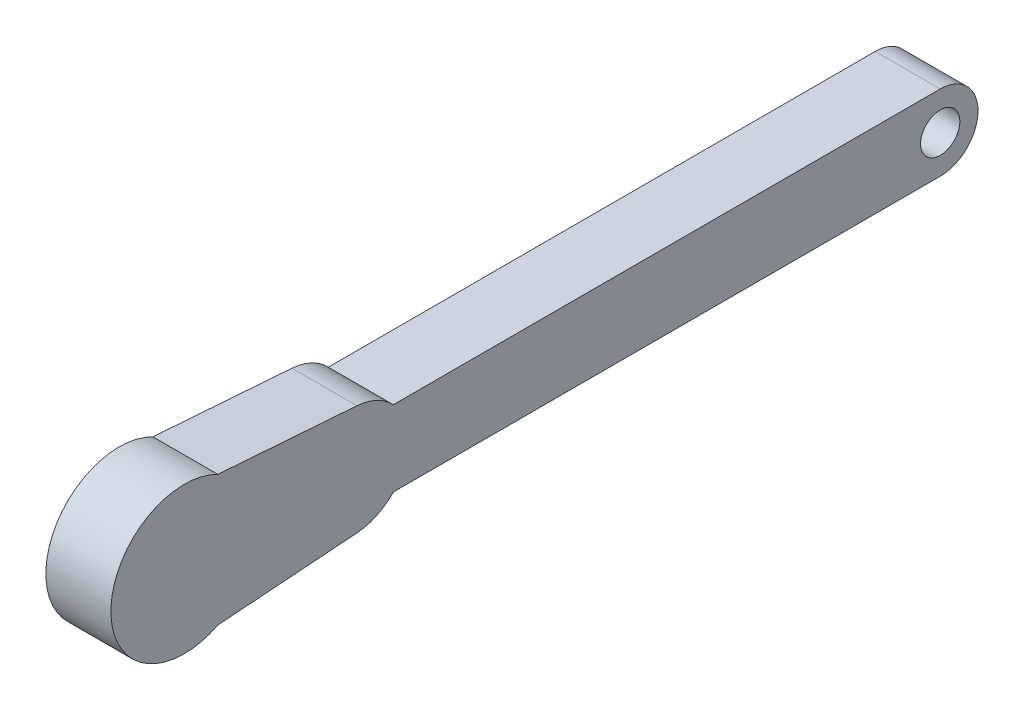
ISO-10303-21;
HEADER;
FILE_DESCRIPTION(('STEP AP214'),'2;1');
FILE_NAME('part.step','',(''),(''),'','','');
FILE_SCHEMA(('AUTOMOTIVE_DESIGN { 1 0 10303 214 1 1 1 1 }'));
ENDSEC;
DATA;
#1=APPLICATION_CONTEXT('core data for automotive mechanical design processes');
#2=APPLICATION_PROTOCOL_DEFINITION('international standard','automotive_design',2000,#1);
#3=PRODUCT_CONTEXT('',#1,'mechanical');
#4=PRODUCT('Part','Part','',(#3));
#5=PRODUCT_RELATED_PRODUCT_CATEGORY('part','',(#4));
#6=PRODUCT_DEFINITION_FORMATION('','',#4);
#7=PRODUCT_DEFINITION_CONTEXT('part definition',#1,'design');
#8=PRODUCT_DEFINITION('design','',#6,#7);
#9=PRODUCT_DEFINITION_SHAPE('','',#8);
#10=(LENGTH_UNIT() NAMED_UNIT(*) SI_UNIT(.MILLI.,.METRE.));
#11=(NAMED_UNIT(*) PLANE_ANGLE_UNIT() SI_UNIT($,.RADIAN.));
#12=(NAMED_UNIT(*) SI_UNIT($,.STERADIAN.) SOLID_ANGLE_UNIT());
#13=UNCERTAINTY_MEASURE_WITH_UNIT(LENGTH_MEASURE(1.E-05),#10,'distance_accuracy_value','');
#14=(GEOMETRIC_REPRESENTATION_CONTEXT(3) GLOBAL_UNCERTAINTY_ASSIGNED_CONTEXT((#13)) GLOBAL_UNIT_ASSIGNED_CONTEXT((#10,
#11,#12)) REPRESENTATION_CONTEXT('',''));
#15=CARTESIAN_POINT('',(0.,0.,0.));
#16=DIRECTION('',(0.,0.,1.));
#17=DIRECTION('',(1.,0.,0.));
#18=AXIS2_PLACEMENT_3D('',#15,#16,#17);
#19=CARTESIAN_POINT('',(-2.73049999999999,3.175,23.1775));
#20=DIRECTION('',(1.,0.,0.));
#21=DIRECTION('',(0.,0.,-1.));
#22=AXIS2_PLACEMENT_3D('',#19,#20,#21);
#23=PLANE('',#22);
#24=CARTESIAN_POINT('',(-2.73049999999999,0.,-45.4025));
#25=DIRECTION('',(-1.,0.,0.));
#26=DIRECTION('',(0.,0.,1.));
#27=AXIS2_PLACEMENT_3D('',#24,#25,#26);
#28=CIRCLE('',#27,1.65);
#29=CARTESIAN_POINT('',(-2.73049999999999,0.,-43.7525));
#30=VERTEX_POINT('',#29);
#31=EDGE_CURVE('E281',#30,#30,#28,.T.);
#32=ORIENTED_EDGE('',*,*,#31,.F.);
#33=EDGE_LOOP('',(#32));
#34=FACE_BOUND('',#33,.T.);
#35=DIRECTION('',(0.,-0.0727458135103877,-0.997350513418784));
#36=VECTOR('',#35,1.);
#37=CARTESIAN_POINT('',(-2.73049999999999,3.11418880814252,16.004814627746));
#38=LINE('',#37,#36);
#39=CARTESIAN_POINT('',(-2.73049999999999,3.11418880814252,16.004814627746));
#40=VERTEX_POINT('',#39);
#41=CARTESIAN_POINT('',(-2.73049999999999,2.22109959338366,3.76049507331097));
#42=VERTEX_POINT('',#41);
#43=EDGE_CURVE('E186',#40,#42,#38,.T.);
#44=ORIENTED_EDGE('',*,*,#43,.F.);
#45=CARTESIAN_POINT('',(-2.73049999999999,0.,18.0974999999986));
#46=DIRECTION('',(-1.,0.,0.));
#47=DIRECTION('',(0.,0.,1.));
#48=AXIS2_PLACEMENT_3D('',#45,#46,#47);
#49=CIRCLE('',#48,3.752);
#50=CARTESIAN_POINT('',(-2.73049999999999,-3.11418880814246,16.004814627746));
#51=VERTEX_POINT('',#50);
#52=EDGE_CURVE('E150',#51,#40,#49,.T.);
#53=ORIENTED_EDGE('',*,*,#52,.F.);
#54=DIRECTION('',(0.,-0.0727458135103876,0.997350513418784));
#55=VECTOR('',#54,1.);
#56=CARTESIAN_POINT('',(-2.73049999999999,-2.22109959338361,3.76049507331097));
#57=LINE('',#56,#55);
#58=CARTESIAN_POINT('',(-2.73049999999999,-2.22109959338361,3.76049507331097));
#59=VERTEX_POINT('',#58);
#60=EDGE_CURVE('E170',#59,#51,#57,.T.);
#61=ORIENTED_EDGE('',*,*,#60,.F.);
#62=CARTESIAN_POINT('',(-2.73049999999999,0.,3.9224999999986));
#63=DIRECTION('',(-1.,0.,0.));
#64=DIRECTION('',(0.,0.,1.));
#65=AXIS2_PLACEMENT_3D('',#62,#63,#64);
#66=CIRCLE('',#65,2.227);
#67=EDGE_CURVE('E174',#42,#59,#66,.T.);
#68=ORIENTED_EDGE('',*,*,#67,.F.);
#69=EDGE_LOOP('',(#44,#53,#61,#68));
#70=FACE_BOUND('',#69,.T.);
#71=CARTESIAN_POINT('',(-2.7305,0.,-45.4025));
#72=DIRECTION('',(1.,0.,0.));
#73=DIRECTION('',(0.,0.,-1.));
#74=AXIS2_PLACEMENT_3D('',#71,#72,#73);
#75=CIRCLE('',#74,3.175);
#76=CARTESIAN_POINT('',(-2.7305,3.175,-45.4025));
#77=VERTEX_POINT('',#76);
#78=CARTESIAN_POINT('',(-2.7305,0.,-48.5775));
#79=VERTEX_POINT('',#78);
#80=EDGE_CURVE('E263',#77,#79,#75,.F.);
#81=ORIENTED_EDGE('',*,*,#80,.T.);
#82=CARTESIAN_POINT('',(-2.7305,0.,-45.4025));
#83=DIRECTION('',(1.,0.,0.));
#84=DIRECTION('',(0.,0.,-1.));
#85=AXIS2_PLACEMENT_3D('',#82,#83,#84);
#86=CIRCLE('',#85,3.175);
#87=CARTESIAN_POINT('',(-2.7305,-3.175,-45.4025));
#88=VERTEX_POINT('',#87);
#89=EDGE_CURVE('E266',#79,#88,#86,.F.);
#90=ORIENTED_EDGE('',*,*,#89,.T.);
#91=DIRECTION('',(0.,0.,1.));
#92=VECTOR('',#91,1.);
#93=CARTESIAN_POINT('',(-2.73049999999999,-3.175,23.1775));
#94=LINE('',#93,#92);
#95=CARTESIAN_POINT('',(-2.73049999999999,-3.175,0.538866597870074));
#96=VERTEX_POINT('',#95);
#97=EDGE_CURVE('E247',#88,#96,#94,.T.);
#98=ORIENTED_EDGE('',*,*,#97,.T.);
#99=CARTESIAN_POINT('',(-2.73049999999999,0.,3.9224999999986));
#100=DIRECTION('',(-1.,0.,0.));
#101=DIRECTION('',(0.,0.,1.));
#102=AXIS2_PLACEMENT_3D('',#99,#100,#101);
#103=CIRCLE('',#102,4.64);
#104=CARTESIAN_POINT('',(-2.73049999999999,-4.62770638226314,3.5849594253104));
#105=VERTEX_POINT('',#104);
#106=EDGE_CURVE('E219',#96,#105,#103,.T.);
#107=ORIENTED_EDGE('',*,*,#106,.T.);
#108=DIRECTION('',(0.,-0.0727458135103876,0.997350513418784));
#109=VECTOR('',#108,1.);
#110=CARTESIAN_POINT('',(-2.73049999999999,-5.48027225622546,15.2737009636567));
#111=LINE('',#110,#109);
#112=CARTESIAN_POINT('',(-2.73049999999999,-5.48027225622546,15.2737009636567));
#113=VERTEX_POINT('',#112);
#114=EDGE_CURVE('E224',#105,#113,#111,.T.);
#115=ORIENTED_EDGE('',*,*,#114,.T.);
#116=CARTESIAN_POINT('',(-2.73049999999999,0.,18.0974999999986));
#117=DIRECTION('',(-1.,0.,0.));
#118=DIRECTION('',(0.,0.,1.));
#119=AXIS2_PLACEMENT_3D('',#116,#117,#118);
#120=CIRCLE('',#119,6.16500000000001);
#121=CARTESIAN_POINT('',(-2.73049999999999,5.48027225622551,15.2737009636567));
#122=VERTEX_POINT('',#121);
#123=EDGE_CURVE('E195',#113,#122,#120,.T.);
#124=ORIENTED_EDGE('',*,*,#123,.T.);
#125=DIRECTION('',(0.,-0.0727458135103877,-0.997350513418784));
#126=VECTOR('',#125,1.);
#127=CARTESIAN_POINT('',(-2.73049999999999,4.62770638226318,3.58495942531041));
#128=LINE('',#127,#126);
#129=CARTESIAN_POINT('',(-2.73049999999999,4.62770638226318,3.58495942531041));
#130=VERTEX_POINT('',#129);
#131=EDGE_CURVE('E215',#122,#130,#128,.T.);
#132=ORIENTED_EDGE('',*,*,#131,.T.);
#133=CARTESIAN_POINT('',(-2.73049999999999,3.175,0.538866597870028));
#134=VERTEX_POINT('',#133);
#135=EDGE_CURVE('E220',#130,#134,#103,.T.);
#136=ORIENTED_EDGE('',*,*,#135,.T.);
#137=DIRECTION('',(0.,0.,1.));
#138=VECTOR('',#137,1.);
#139=CARTESIAN_POINT('',(-2.73049999999999,3.175,23.1775));
#140=LINE('',#139,#138);
#141=EDGE_CURVE('E248',#77,#134,#140,.T.);
#142=ORIENTED_EDGE('',*,*,#141,.F.);
#143=EDGE_LOOP('',(#81,#90,#98,#107,#115,#124,#132,#136,#142));
#144=FACE_BOUND('',#143,.T.);
#145=ADVANCED_FACE('F47',(#34,#70,#144),#23,.F.);
#146=CARTESIAN_POINT('',(2.73049999999999,3.175,23.1775));
#147=DIRECTION('',(-1.,0.,0.));
#148=DIRECTION('',(0.,0.,1.));
#149=AXIS2_PLACEMENT_3D('',#146,#147,#148);
#150=PLANE('',#149);
#151=CARTESIAN_POINT('',(2.7305,0.,-45.4025));
#152=DIRECTION('',(-1.,0.,0.));
#153=DIRECTION('',(0.,0.,1.));
#154=AXIS2_PLACEMENT_3D('',#151,#152,#153);
#155=CIRCLE('',#154,1.65);
#156=CARTESIAN_POINT('',(2.7305,0.,-43.7525));
#157=VERTEX_POINT('',#156);
#158=EDGE_CURVE('E177',#157,#157,#155,.T.);
#159=ORIENTED_EDGE('',*,*,#158,.T.);
#160=EDGE_LOOP('',(#159));
#161=FACE_BOUND('',#160,.T.);
#162=DIRECTION('',(0.,0.,-1.));
#163=VECTOR('',#162,1.);
#164=CARTESIAN_POINT('',(2.73049999999999,-3.175,23.1775));
#165=LINE('',#164,#163);
#166=CARTESIAN_POINT('',(2.73049999999999,-3.175,0.538866597870072));
#167=VERTEX_POINT('',#166);
#168=CARTESIAN_POINT('',(2.7305,-3.175,-45.4025));
#169=VERTEX_POINT('',#168);
#170=EDGE_CURVE('E252',#167,#169,#165,.T.);
#171=ORIENTED_EDGE('',*,*,#170,.T.);
#172=CARTESIAN_POINT('',(2.7305,0.,-45.4025));
#173=DIRECTION('',(-1.,0.,0.));
#174=DIRECTION('',(0.,0.,1.));
#175=AXIS2_PLACEMENT_3D('',#172,#173,#174);
#176=CIRCLE('',#175,3.175);
#177=CARTESIAN_POINT('',(2.7305,0.,-48.5775));
#178=VERTEX_POINT('',#177);
#179=EDGE_CURVE('E64',#169,#178,#176,.F.);
#180=ORIENTED_EDGE('',*,*,#179,.T.);
#181=CARTESIAN_POINT('',(2.7305,0.,-45.4025));
#182=DIRECTION('',(-1.,0.,0.));
#183=DIRECTION('',(0.,0.,1.));
#184=AXIS2_PLACEMENT_3D('',#181,#182,#183);
#185=CIRCLE('',#184,3.175);
#186=CARTESIAN_POINT('',(2.7305,3.175,-45.4025));
#187=VERTEX_POINT('',#186);
#188=EDGE_CURVE('E68',#178,#187,#185,.F.);
#189=ORIENTED_EDGE('',*,*,#188,.T.);
#190=DIRECTION('',(0.,0.,-1.));
#191=VECTOR('',#190,1.);
#192=CARTESIAN_POINT('',(2.73049999999999,3.175,23.1775));
#193=LINE('',#192,#191);
#194=CARTESIAN_POINT('',(2.73049999999999,3.175,0.538866597870028));
#195=VERTEX_POINT('',#194);
#196=EDGE_CURVE('E251',#195,#187,#193,.T.);
#197=ORIENTED_EDGE('',*,*,#196,.F.);
#198=CARTESIAN_POINT('',(2.73049999999999,0.,3.9224999999986));
#199=DIRECTION('',(-1.,0.,0.));
#200=DIRECTION('',(0.,0.,1.));
#201=AXIS2_PLACEMENT_3D('',#198,#199,#200);
#202=CIRCLE('',#201,4.64);
#203=CARTESIAN_POINT('',(2.73049999999999,4.62770638226318,3.58495942531041));
#204=VERTEX_POINT('',#203);
#205=EDGE_CURVE('E205',#195,#204,#202,.F.);
#206=ORIENTED_EDGE('',*,*,#205,.T.);
#207=DIRECTION('',(0.,0.0727458135103877,0.997350513418784));
#208=VECTOR('',#207,1.);
#209=CARTESIAN_POINT('',(2.73049999999999,4.62770638226318,3.5849594253104));
#210=LINE('',#209,#208);
#211=CARTESIAN_POINT('',(2.73049999999999,5.48027225622551,15.2737009636567));
#212=VERTEX_POINT('',#211);
#213=EDGE_CURVE('E211',#204,#212,#210,.T.);
#214=ORIENTED_EDGE('',*,*,#213,.T.);
#215=CARTESIAN_POINT('',(2.73049999999999,0.,18.0974999999986));
#216=DIRECTION('',(-1.,0.,0.));
#217=DIRECTION('',(0.,0.,1.));
#218=AXIS2_PLACEMENT_3D('',#215,#216,#217);
#219=CIRCLE('',#218,6.16500000000001);
#220=CARTESIAN_POINT('',(2.73049999999999,-5.48027225622546,15.2737009636567));
#221=VERTEX_POINT('',#220);
#222=EDGE_CURVE('E208',#212,#221,#219,.F.);
#223=ORIENTED_EDGE('',*,*,#222,.T.);
#224=DIRECTION('',(0.,0.0727458135103876,-0.997350513418784));
#225=VECTOR('',#224,1.);
#226=CARTESIAN_POINT('',(2.73049999999999,-5.48027225622546,15.2737009636567));
#227=LINE('',#226,#225);
#228=CARTESIAN_POINT('',(2.73049999999999,-4.62770638226314,3.5849594253104));
#229=VERTEX_POINT('',#228);
#230=EDGE_CURVE('E204',#221,#229,#227,.T.);
#231=ORIENTED_EDGE('',*,*,#230,.T.);
#232=EDGE_CURVE('E201',#229,#167,#202,.F.);
#233=ORIENTED_EDGE('',*,*,#232,.T.);
#234=EDGE_LOOP('',(#171,#180,#189,#197,#206,#214,#223,#231,#233));
#235=FACE_BOUND('',#234,.T.);
#236=ADVANCED_FACE('F305',(#161,#235),#150,.F.);
#237=CARTESIAN_POINT('',(0.,3.175,0.));
#238=DIRECTION('',(0.,1.,0.));
#239=DIRECTION('',(0.,0.,1.));
#240=AXIS2_PLACEMENT_3D('',#237,#238,#239);
#241=PLANE('',#240);
#242=ORIENTED_EDGE('',*,*,#196,.T.);
#243=DIRECTION('',(-1.,0.,0.));
#244=VECTOR('',#243,1.);
#245=CARTESIAN_POINT('',(-2.7305,3.175,-45.4025));
#246=LINE('',#245,#244);
#247=EDGE_CURVE('E57',#187,#77,#246,.T.);
#248=ORIENTED_EDGE('',*,*,#247,.T.);
#249=ORIENTED_EDGE('',*,*,#141,.T.);
#250=DIRECTION('',(-1.,0.,0.));
#251=VECTOR('',#250,1.);
#252=CARTESIAN_POINT('',(30.5878024537553,3.175,0.538866597870028));
#253=LINE('',#252,#251);
#254=EDGE_CURVE('E243',#195,#134,#253,.T.);
#255=ORIENTED_EDGE('',*,*,#254,.F.);
#256=EDGE_LOOP('',(#242,#248,#249,#255));
#257=FACE_BOUND('',#256,.T.);
#258=ADVANCED_FACE('F312',(#257),#241,.T.);
#259=CARTESIAN_POINT('',(0.,-3.175,0.));
#260=DIRECTION('',(0.,1.,0.));
#261=DIRECTION('',(0.,0.,1.));
#262=AXIS2_PLACEMENT_3D('',#259,#260,#261);
#263=PLANE('',#262);
#264=ORIENTED_EDGE('',*,*,#97,.F.);
#265=DIRECTION('',(-1.,0.,0.));
#266=VECTOR('',#265,1.);
#267=CARTESIAN_POINT('',(0.,-3.175,-45.4025));
#268=LINE('',#267,#266);
#269=EDGE_CURVE('E269',#88,#169,#268,.F.);
#270=ORIENTED_EDGE('',*,*,#269,.T.);
#271=ORIENTED_EDGE('',*,*,#170,.F.);
#272=DIRECTION('',(-1.,0.,0.));
#273=VECTOR('',#272,1.);
#274=CARTESIAN_POINT('',(30.5878024537553,-3.175,0.538866597870074));
#275=LINE('',#274,#273);
#276=EDGE_CURVE('E255',#167,#96,#275,.T.);
#277=ORIENTED_EDGE('',*,*,#276,.T.);
#278=EDGE_LOOP('',(#264,#270,#271,#277));
#279=FACE_BOUND('',#278,.T.);
#280=ADVANCED_FACE('F376',(#279),#263,.F.);
#281=CARTESIAN_POINT('',(30.5878024537553,0.,3.9224999999986));
#282=DIRECTION('',(-1.,0.,0.));
#283=DIRECTION('',(0.,0.,1.));
#284=AXIS2_PLACEMENT_3D('',#281,#282,#283);
#285=CYLINDRICAL_SURFACE('',#284,4.64);
#286=ORIENTED_EDGE('',*,*,#276,.F.);
#287=ORIENTED_EDGE('',*,*,#232,.F.);
#288=DIRECTION('',(-1.,0.,0.));
#289=VECTOR('',#288,1.);
#290=CARTESIAN_POINT('',(30.5878024537553,-4.62770638226314,3.5849594253104));
#291=LINE('',#290,#289);
#292=EDGE_CURVE('E232',#229,#105,#291,.T.);
#293=ORIENTED_EDGE('',*,*,#292,.T.);
#294=ORIENTED_EDGE('',*,*,#106,.F.);
#295=EDGE_LOOP('',(#286,#287,#293,#294));
#296=FACE_BOUND('',#295,.T.);
#297=ADVANCED_FACE('F351',(#296),#285,.T.);
#298=CARTESIAN_POINT('',(30.5878024537553,0.,18.0974999999986));
#299=DIRECTION('',(-1.,0.,0.));
#300=DIRECTION('',(0.,0.,1.));
#301=AXIS2_PLACEMENT_3D('',#298,#299,#300);
#302=CYLINDRICAL_SURFACE('',#301,6.16500000000001);
#303=ORIENTED_EDGE('',*,*,#222,.F.);
#304=DIRECTION('',(-1.,0.,0.));
#305=VECTOR('',#304,1.);
#306=CARTESIAN_POINT('',(30.5878024537553,5.48027225622551,15.2737009636567));
#307=LINE('',#306,#305);
#308=EDGE_CURVE('E228',#212,#122,#307,.T.);
#309=ORIENTED_EDGE('',*,*,#308,.T.);
#310=ORIENTED_EDGE('',*,*,#123,.F.);
#311=DIRECTION('',(-1.,0.,0.));
#312=VECTOR('',#311,1.);
#313=CARTESIAN_POINT('',(30.5878024537553,-5.48027225622546,15.2737009636567));
#314=LINE('',#313,#312);
#315=EDGE_CURVE('E229',#221,#113,#314,.T.);
#316=ORIENTED_EDGE('',*,*,#315,.F.);
#317=EDGE_LOOP('',(#303,#309,#310,#316));
#318=FACE_BOUND('',#317,.T.);
#319=ADVANCED_FACE('F358',(#318),#302,.T.);
#320=CARTESIAN_POINT('',(30.5878024537553,-5.48027225622546,15.2737009636567));
#321=DIRECTION('',(0.,-0.997350513418784,-0.0727458135103876));
#322=DIRECTION('',(0.,0.0727458135103876,-0.997350513418784));
#323=AXIS2_PLACEMENT_3D('',#320,#321,#322);
#324=PLANE('',#323);
#325=ORIENTED_EDGE('',*,*,#230,.F.);
#326=ORIENTED_EDGE('',*,*,#315,.T.);
#327=ORIENTED_EDGE('',*,*,#114,.F.);
#328=ORIENTED_EDGE('',*,*,#292,.F.);
#329=EDGE_LOOP('',(#325,#326,#327,#328));
#330=FACE_BOUND('',#329,.T.);
#331=ADVANCED_FACE('F354',(#330),#324,.T.);
#332=ORIENTED_EDGE('',*,*,#205,.F.);
#333=ORIENTED_EDGE('',*,*,#254,.T.);
#334=ORIENTED_EDGE('',*,*,#135,.F.);
#335=DIRECTION('',(-1.,0.,0.));
#336=VECTOR('',#335,1.);
#337=CARTESIAN_POINT('',(30.5878024537553,4.62770638226318,3.58495942531041));
#338=LINE('',#337,#336);
#339=EDGE_CURVE('E236',#204,#130,#338,.T.);
#340=ORIENTED_EDGE('',*,*,#339,.F.);
#341=EDGE_LOOP('',(#332,#333,#334,#340));
#342=FACE_BOUND('',#341,.T.);
#343=ADVANCED_FACE('F339',(#342),#285,.T.);
#344=CARTESIAN_POINT('',(30.5878024537553,4.62770638226318,3.58495942531041));
#345=DIRECTION('',(0.,0.997350513418784,-0.0727458135103877));
#346=DIRECTION('',(0.,0.0727458135103877,0.997350513418784));
#347=AXIS2_PLACEMENT_3D('',#344,#345,#346);
#348=PLANE('',#347);
#349=ORIENTED_EDGE('',*,*,#213,.F.);
#350=ORIENTED_EDGE('',*,*,#339,.T.);
#351=ORIENTED_EDGE('',*,*,#131,.F.);
#352=ORIENTED_EDGE('',*,*,#308,.F.);
#353=EDGE_LOOP('',(#349,#350,#351,#352));
#354=FACE_BOUND('',#353,.T.);
#355=ADVANCED_FACE('F361',(#354),#348,.T.);
#356=CARTESIAN_POINT('',(-0.698499999999994,0.,18.0974999999986));
#357=DIRECTION('',(-1.,0.,0.));
#358=DIRECTION('',(0.,0.,1.));
#359=AXIS2_PLACEMENT_3D('',#356,#357,#358);
#360=CYLINDRICAL_SURFACE('',#359,3.752);
#361=ORIENTED_EDGE('',*,*,#52,.T.);
#362=DIRECTION('',(-1.,0.,0.));
#363=VECTOR('',#362,1.);
#364=CARTESIAN_POINT('',(-0.698499999999994,3.11418880814252,16.004814627746));
#365=LINE('',#364,#363);
#366=CARTESIAN_POINT('',(-0.698499999999994,3.11418880814252,16.004814627746));
#367=VERTEX_POINT('',#366);
#368=EDGE_CURVE('E143',#367,#40,#365,.T.);
#369=ORIENTED_EDGE('',*,*,#368,.F.);
#370=CARTESIAN_POINT('',(-0.698499999999994,0.,18.0974999999986));
#371=DIRECTION('',(-1.,0.,0.));
#372=DIRECTION('',(0.,0.,1.));
#373=AXIS2_PLACEMENT_3D('',#370,#371,#372);
#374=CIRCLE('',#373,3.752);
#375=CARTESIAN_POINT('',(-0.698499999999994,-3.11418880814246,16.004814627746));
#376=VERTEX_POINT('',#375);
#377=EDGE_CURVE('E147',#376,#367,#374,.T.);
#378=ORIENTED_EDGE('',*,*,#377,.F.);
#379=DIRECTION('',(-1.,0.,0.));
#380=VECTOR('',#379,1.);
#381=CARTESIAN_POINT('',(-0.698499999999994,-3.11418880814246,16.004814627746));
#382=LINE('',#381,#380);
#383=EDGE_CURVE('E192',#376,#51,#382,.T.);
#384=ORIENTED_EDGE('',*,*,#383,.T.);
#385=EDGE_LOOP('',(#361,#369,#378,#384));
#386=FACE_BOUND('',#385,.T.);
#387=ADVANCED_FACE('F145',(#386),#360,.F.);
#388=CARTESIAN_POINT('',(-0.698499999999994,-2.22109959338361,3.76049507331097));
#389=DIRECTION('',(0.,-0.997350513418784,-0.0727458135103875));
#390=DIRECTION('',(0.,0.0727458135103876,-0.997350513418784));
#391=AXIS2_PLACEMENT_3D('',#388,#389,#390);
#392=PLANE('',#391);
#393=ORIENTED_EDGE('',*,*,#60,.T.);
#394=ORIENTED_EDGE('',*,*,#383,.F.);
#395=DIRECTION('',(0.,-0.0727458135103876,0.997350513418784));
#396=VECTOR('',#395,1.);
#397=CARTESIAN_POINT('',(-0.698499999999994,-2.22109959338361,3.76049507331097));
#398=LINE('',#397,#396);
#399=CARTESIAN_POINT('',(-0.698499999999994,-2.22109959338361,3.76049507331097));
#400=VERTEX_POINT('',#399);
#401=EDGE_CURVE('E156',#400,#376,#398,.T.);
#402=ORIENTED_EDGE('',*,*,#401,.F.);
#403=DIRECTION('',(-1.,0.,0.));
#404=VECTOR('',#403,1.);
#405=CARTESIAN_POINT('',(-0.698499999999994,-2.22109959338361,3.76049507331097));
#406=LINE('',#405,#404);
#407=EDGE_CURVE('E196',#400,#59,#406,.T.);
#408=ORIENTED_EDGE('',*,*,#407,.T.);
#409=EDGE_LOOP('',(#393,#394,#402,#408));
#410=FACE_BOUND('',#409,.T.);
#411=ADVANCED_FACE('F368',(#410),#392,.F.);
#412=CARTESIAN_POINT('',(-0.698499999999994,0.,3.9224999999986));
#413=DIRECTION('',(-1.,0.,0.));
#414=DIRECTION('',(0.,0.,1.));
#415=AXIS2_PLACEMENT_3D('',#412,#413,#414);
#416=CYLINDRICAL_SURFACE('',#415,2.227);
#417=ORIENTED_EDGE('',*,*,#67,.T.);
#418=ORIENTED_EDGE('',*,*,#407,.F.);
#419=CARTESIAN_POINT('',(-0.698499999999994,0.,3.9224999999986));
#420=DIRECTION('',(-1.,0.,0.));
#421=DIRECTION('',(0.,0.,1.));
#422=AXIS2_PLACEMENT_3D('',#419,#420,#421);
#423=CIRCLE('',#422,2.227);
#424=CARTESIAN_POINT('',(-0.698499999999994,2.22109959338366,3.76049507331097));
#425=VERTEX_POINT('',#424);
#426=EDGE_CURVE('E165',#425,#400,#423,.T.);
#427=ORIENTED_EDGE('',*,*,#426,.F.);
#428=DIRECTION('',(-1.,0.,0.));
#429=VECTOR('',#428,1.);
#430=CARTESIAN_POINT('',(-0.698499999999994,2.22109959338366,3.76049507331097));
#431=LINE('',#430,#429);
#432=EDGE_CURVE('E155',#425,#42,#431,.T.);
#433=ORIENTED_EDGE('',*,*,#432,.T.);
#434=EDGE_LOOP('',(#417,#418,#427,#433));
#435=FACE_BOUND('',#434,.T.);
#436=ADVANCED_FACE('F422',(#435),#416,.F.);
#437=CARTESIAN_POINT('',(-0.698499999999994,3.11418880814252,16.004814627746));
#438=DIRECTION('',(0.,0.997350513418784,-0.0727458135103877));
#439=DIRECTION('',(0.,0.0727458135103877,0.997350513418784));
#440=AXIS2_PLACEMENT_3D('',#437,#438,#439);
#441=PLANE('',#440);
#442=ORIENTED_EDGE('',*,*,#43,.T.);
#443=ORIENTED_EDGE('',*,*,#432,.F.);
#444=DIRECTION('',(0.,-0.0727458135103877,-0.997350513418784));
#445=VECTOR('',#444,1.);
#446=CARTESIAN_POINT('',(-0.698499999999994,3.11418880814252,16.004814627746));
#447=LINE('',#446,#445);
#448=EDGE_CURVE('E159',#367,#425,#447,.T.);
#449=ORIENTED_EDGE('',*,*,#448,.F.);
#450=ORIENTED_EDGE('',*,*,#368,.T.);
#451=EDGE_LOOP('',(#442,#443,#449,#450));
#452=FACE_BOUND('',#451,.T.);
#453=ADVANCED_FACE('F160',(#452),#441,.F.);
#454=CARTESIAN_POINT('',(-0.698499999999994,0.,18.0974999999986));
#455=DIRECTION('',(-1.,0.,0.));
#456=DIRECTION('',(0.,0.,1.));
#457=AXIS2_PLACEMENT_3D('',#454,#455,#456);
#458=PLANE('',#457);
#459=CARTESIAN_POINT('',(-0.698499999999994,0.,18.0975));
#460=DIRECTION('',(-1.,0.,0.));
#461=DIRECTION('',(0.,0.,1.));
#462=AXIS2_PLACEMENT_3D('',#459,#460,#461);
#463=CIRCLE('',#462,2.500000016);
#464=CARTESIAN_POINT('',(-0.698499999999994,0.,20.597500016));
#465=VERTEX_POINT('',#464);
#466=EDGE_CURVE('E11',#465,#465,#463,.F.);
#467=ORIENTED_EDGE('',*,*,#466,.T.);
#468=EDGE_LOOP('',(#467));
#469=FACE_BOUND('',#468,.T.);
#470=ORIENTED_EDGE('',*,*,#377,.T.);
#471=ORIENTED_EDGE('',*,*,#448,.T.);
#472=ORIENTED_EDGE('',*,*,#426,.T.);
#473=ORIENTED_EDGE('',*,*,#401,.T.);
#474=EDGE_LOOP('',(#470,#471,#472,#473));
#475=FACE_BOUND('',#474,.T.);
#476=ADVANCED_FACE('F167',(#469,#475),#458,.T.);
#477=CARTESIAN_POINT('',(-2.73049999999999,0.,-45.4025));
#478=DIRECTION('',(-1.,0.,0.));
#479=DIRECTION('',(0.,0.,1.));
#480=AXIS2_PLACEMENT_3D('',#477,#478,#479);
#481=CYLINDRICAL_SURFACE('',#480,1.65);
#482=ORIENTED_EDGE('',*,*,#158,.F.);
#483=EDGE_LOOP('',(#482));
#484=FACE_BOUND('',#483,.T.);
#485=ORIENTED_EDGE('',*,*,#31,.T.);
#486=EDGE_LOOP('',(#485));
#487=FACE_BOUND('',#486,.T.);
#488=ADVANCED_FACE('F322',(#484,#487),#481,.F.);
#489=CARTESIAN_POINT('',(0.,0.,-45.4025));
#490=DIRECTION('',(1.,0.,0.));
#491=DIRECTION('',(0.,0.,-1.));
#492=AXIS2_PLACEMENT_3D('',#489,#490,#491);
#493=CYLINDRICAL_SURFACE('',#492,3.175);
#494=ORIENTED_EDGE('',*,*,#247,.F.);
#495=ORIENTED_EDGE('',*,*,#188,.F.);
#496=DIRECTION('',(-1.,0.,0.));
#497=VECTOR('',#496,1.);
#498=CARTESIAN_POINT('',(2.7305,0.,-48.5775));
#499=LINE('',#498,#497);
#500=EDGE_CURVE('E278',#79,#178,#499,.F.);
#501=ORIENTED_EDGE('',*,*,#500,.F.);
#502=ORIENTED_EDGE('',*,*,#80,.F.);
#503=EDGE_LOOP('',(#494,#495,#501,#502));
#504=FACE_BOUND('',#503,.T.);
#505=ADVANCED_FACE('F320',(#504),#493,.T.);
#506=CARTESIAN_POINT('',(-2.7305,0.,-45.4025));
#507=DIRECTION('',(-1.,0.,0.));
#508=DIRECTION('',(0.,0.,1.));
#509=AXIS2_PLACEMENT_3D('',#506,#507,#508);
#510=CYLINDRICAL_SURFACE('',#509,3.175);
#511=ORIENTED_EDGE('',*,*,#179,.F.);
#512=ORIENTED_EDGE('',*,*,#269,.F.);
#513=ORIENTED_EDGE('',*,*,#89,.F.);
#514=ORIENTED_EDGE('',*,*,#500,.T.);
#515=EDGE_LOOP('',(#511,#512,#513,#514));
#516=FACE_BOUND('',#515,.T.);
#517=ADVANCED_FACE('F301',(#516),#510,.T.);
#518=CARTESIAN_POINT('',(-0.198499983999994,0.,18.0975));
#519=DIRECTION('',(-1.,0.,0.));
#520=DIRECTION('',(0.,0.,1.));
#521=AXIS2_PLACEMENT_3D('',#518,#519,#520);
#522=PLANE('',#521);
#523=CARTESIAN_POINT('',(-0.198499983999994,0.,18.0975));
#524=DIRECTION('',(-1.,0.,0.));
#525=DIRECTION('',(0.,0.,1.));
#526=AXIS2_PLACEMENT_3D('',#523,#524,#525);
#527=CIRCLE('',#526,2.);
#528=CARTESIAN_POINT('',(-0.198499983999994,0.,20.0975));
#529=VERTEX_POINT('',#528);
#530=EDGE_CURVE('E282',#529,#529,#527,.T.);
#531=ORIENTED_EDGE('',*,*,#530,.T.);
#532=EDGE_LOOP('',(#531));
#533=FACE_BOUND('',#532,.T.);
#534=ADVANCED_FACE('F293',(#533),#522,.T.);
#535=CARTESIAN_POINT('',(-0.198499983999995,0.,18.0975));
#536=DIRECTION('',(-1.,0.,0.));
#537=DIRECTION('',(0.,0.,1.));
#538=AXIS2_PLACEMENT_3D('',#535,#536,#537);
#539=CONICAL_SURFACE('',#538,2.,0.78539816339745);
#540=CARTESIAN_POINT('',(-0.698499999999994,0.,20.597500016));
#541=CARTESIAN_POINT('',(-0.693291666499993,0.,20.5922916825));
#542=CARTESIAN_POINT('',(-0.688083332999993,0.,20.587083349));
#543=CARTESIAN_POINT('',(-0.677666665999994,0.,20.576666682));
#544=CARTESIAN_POINT('',(-0.672458332499994,0.,20.5714583485));
#545=CARTESIAN_POINT('',(-0.662041665499994,0.,20.5610416815));
#546=CARTESIAN_POINT('',(-0.656833331999994,0.,20.555833348));
#547=CARTESIAN_POINT('',(-0.646416664999994,0.,20.545416681));
#548=CARTESIAN_POINT('',(-0.641208331499994,0.,20.5402083475));
#549=CARTESIAN_POINT('',(-0.630791664499993,0.,20.5297916805));
#550=CARTESIAN_POINT('',(-0.625583330999994,0.,20.524583347));
#551=CARTESIAN_POINT('',(-0.615166663999994,0.,20.51416668));
#552=CARTESIAN_POINT('',(-0.609958330499994,0.,20.5089583465));
#553=CARTESIAN_POINT('',(-0.599541663499994,0.,20.4985416795));
#554=CARTESIAN_POINT('',(-0.594333329999994,0.,20.493333346));
#555=CARTESIAN_POINT('',(-0.583916662999993,0.,20.482916679));
#556=CARTESIAN_POINT('',(-0.578708329499994,0.,20.4777083455));
#557=CARTESIAN_POINT('',(-0.568291662499994,0.,20.4672916785));
#558=CARTESIAN_POINT('',(-0.563083328999994,0.,20.462083345));
#559=CARTESIAN_POINT('',(-0.552666661999994,0.,20.451666678));
#560=CARTESIAN_POINT('',(-0.547458328499994,0.,20.4464583445));
#561=CARTESIAN_POINT('',(-0.537041661499993,0.,20.4360416775));
#562=CARTESIAN_POINT('',(-0.531833327999994,0.,20.430833344));
#563=CARTESIAN_POINT('',(-0.521416660999994,0.,20.420416677));
#564=CARTESIAN_POINT('',(-0.516208327499994,0.,20.4152083435));
#565=CARTESIAN_POINT('',(-0.505791660499994,0.,20.4047916765));
#566=CARTESIAN_POINT('',(-0.500583326999994,0.,20.399583343));
#567=CARTESIAN_POINT('',(-0.490166659999994,0.,20.389166676));
#568=CARTESIAN_POINT('',(-0.484958326499993,0.,20.3839583425));
#569=CARTESIAN_POINT('',(-0.474541659499993,0.,20.3735416755));
#570=CARTESIAN_POINT('',(-0.469333325999994,0.,20.368333342));
#571=CARTESIAN_POINT('',(-0.458916658999994,0.,20.357916675));
#572=CARTESIAN_POINT('',(-0.453708325499994,0.,20.3527083415));
#573=CARTESIAN_POINT('',(-0.443291658499994,0.,20.3422916745));
#574=CARTESIAN_POINT('',(-0.438083324999994,0.,20.337083341));
#575=CARTESIAN_POINT('',(-0.427666657999993,0.,20.326666674));
#576=CARTESIAN_POINT('',(-0.422458324499994,0.,20.3214583405));
#577=CARTESIAN_POINT('',(-0.412041657499994,0.,20.3110416735));
#578=CARTESIAN_POINT('',(-0.406833323999994,0.,20.30583334));
#579=CARTESIAN_POINT('',(-0.396416656999994,0.,20.295416673));
#580=CARTESIAN_POINT('',(-0.391208323499994,0.,20.2902083395));
#581=CARTESIAN_POINT('',(-0.380791656499994,0.,20.2797916725));
#582=CARTESIAN_POINT('',(-0.375583322999994,0.,20.274583339));
#583=CARTESIAN_POINT('',(-0.365166655999993,0.,20.264166672));
#584=CARTESIAN_POINT('',(-0.359958322499994,0.,20.2589583385));
#585=CARTESIAN_POINT('',(-0.349541655499994,0.,20.2485416715));
#586=CARTESIAN_POINT('',(-0.344333321999994,0.,20.243333338));
#587=CARTESIAN_POINT('',(-0.333916654999994,0.,20.232916671));
#588=CARTESIAN_POINT('',(-0.328708321499994,0.,20.2277083375));
#589=CARTESIAN_POINT('',(-0.318291654499993,0.,20.2172916705));
#590=CARTESIAN_POINT('',(-0.313083320999994,0.,20.212083337));
#591=CARTESIAN_POINT('',(-0.302666653999994,0.,20.20166667));
#592=CARTESIAN_POINT('',(-0.297458320499994,0.,20.1964583365));
#593=CARTESIAN_POINT('',(-0.287041653499994,0.,20.1860416695));
#594=CARTESIAN_POINT('',(-0.281833319999994,0.,20.180833336));
#595=CARTESIAN_POINT('',(-0.271416652999993,0.,20.170416669));
#596=CARTESIAN_POINT('',(-0.266208319499994,0.,20.1652083355));
#597=CARTESIAN_POINT('',(-0.255791652499994,0.,20.1547916685));
#598=CARTESIAN_POINT('',(-0.250583318999994,0.,20.149583335));
#599=CARTESIAN_POINT('',(-0.240166651999994,0.,20.139166668));
#600=CARTESIAN_POINT('',(-0.234958318499994,0.,20.1339583345));
#601=CARTESIAN_POINT('',(-0.224541651499993,0.,20.1235416675));
#602=CARTESIAN_POINT('',(-0.219333317999994,0.,20.118333334));
#603=CARTESIAN_POINT('',(-0.208916650999994,0.,20.107916667));
#604=CARTESIAN_POINT('',(-0.203708317499994,0.,20.1027083335));
#605=CARTESIAN_POINT('',(-0.198499983999994,0.,20.0975));
#606=B_SPLINE_CURVE_WITH_KNOTS('',3,(#540,#541,#542,#543,#544,#545,#546,#547,#548,#549,#550,
#551,#552,#553,#554,#555,#556,#557,#558,#559,#560,#561,#562,#563,#564,#565,#566,#567,#568,#569,
#570,#571,#572,#573,#574,#575,#576,#577,#578,#579,#580,#581,#582,#583,#584,#585,#586,#587,#588,
#589,#590,#591,#592,#593,#594,#595,#596,#597,#598,#599,#600,#601,#602,#603,#604,#605),
.UNSPECIFIED.,.F.,.F.,(4,2,2,2,2,2,2,2,2,2,2,2,2,2,2,2,2,2,2,2,2,2,2,2,2,2,2,2,2,2,2,2,4),(0.,
0.0220970876191846,0.0441941752383718,0.066291262857559,0.0883883504767437,0.110485438095931,
0.132582525715118,0.154679613334303,0.17677670095349,0.198873788572677,0.220970876191862,
0.243067963811049,0.265165051430236,0.287262139049423,0.309359226668608,0.331456314287795,
0.353553401906982,0.375650489526167,0.397747577145354,0.419844664764541,0.441941752383729,
0.464038840002913,0.486135927622101,0.508233015241288,0.530330102860472,0.552427190479659,
0.574524278098847,0.596621365718031,0.618718453337219,0.640815540956406,0.66291262857559,
0.685009716194778,0.707106803813965),.UNSPECIFIED.);
#607=EDGE_CURVE('BSEAM50',#465,#529,#606,.T.);
#608=ORIENTED_EDGE('',*,*,#466,.F.);
#609=ORIENTED_EDGE('',*,*,#530,.F.);
#610=ORIENTED_EDGE('',*,*,#607,.T.);
#611=ORIENTED_EDGE('',*,*,#607,.F.);
#612=EDGE_LOOP('',(#608,#610,#609,#611));
#613=FACE_BOUND('',#612,.T.);
#614=ADVANCED_FACE('F50',(#613),#539,.F.);
#615=CLOSED_SHELL('',(#145,#236,#258,#280,#297,#319,#331,#343,#355,#387,#411,#436,#453,#476,
#488,#505,#517,#534,#614));
#616=MANIFOLD_SOLID_BREP('B2',#615);
#617=ADVANCED_BREP_SHAPE_REPRESENTATION('',(#18,#616),#14);
#618=SHAPE_DEFINITION_REPRESENTATION(#9,#617);
ENDSEC;
END-ISO-10303-21;
